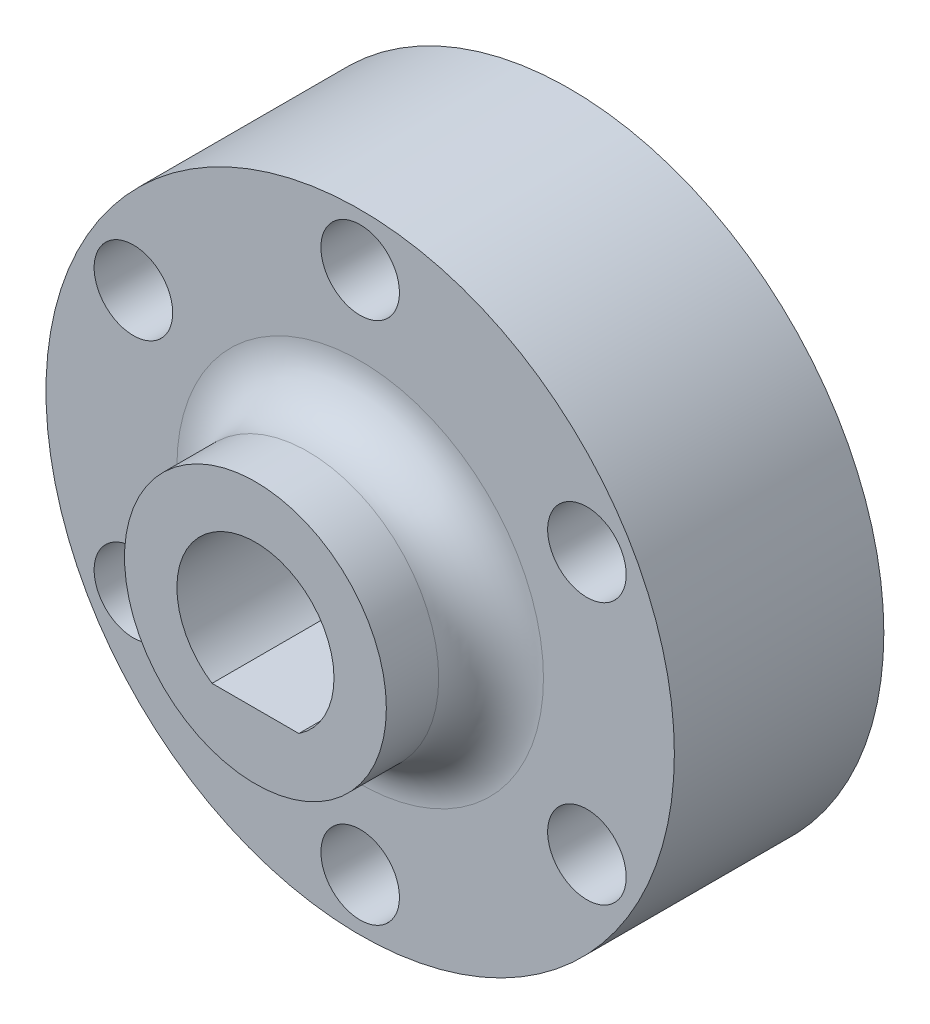
ISO-10303-21;
HEADER;
FILE_DESCRIPTION(('STEP AP214'),'2;1');
FILE_NAME('part.step','',(''),(''),'','','');
FILE_SCHEMA(('AUTOMOTIVE_DESIGN { 1 0 10303 214 1 1 1 1 }'));
ENDSEC;
DATA;
#1=APPLICATION_CONTEXT('core data for automotive mechanical design processes');
#2=APPLICATION_PROTOCOL_DEFINITION('international standard','automotive_design',2000,#1);
#3=PRODUCT_CONTEXT('',#1,'mechanical');
#4=PRODUCT('Part','Part','',(#3));
#5=PRODUCT_RELATED_PRODUCT_CATEGORY('part','',(#4));
#6=PRODUCT_DEFINITION_FORMATION('','',#4);
#7=PRODUCT_DEFINITION_CONTEXT('part definition',#1,'design');
#8=PRODUCT_DEFINITION('design','',#6,#7);
#9=PRODUCT_DEFINITION_SHAPE('','',#8);
#10=(LENGTH_UNIT() NAMED_UNIT(*) SI_UNIT(.MILLI.,.METRE.));
#11=(NAMED_UNIT(*) PLANE_ANGLE_UNIT() SI_UNIT($,.RADIAN.));
#12=(NAMED_UNIT(*) SI_UNIT($,.STERADIAN.) SOLID_ANGLE_UNIT());
#13=UNCERTAINTY_MEASURE_WITH_UNIT(LENGTH_MEASURE(1.E-05),#10,'distance_accuracy_value','');
#14=(GEOMETRIC_REPRESENTATION_CONTEXT(3) GLOBAL_UNCERTAINTY_ASSIGNED_CONTEXT((#13)) GLOBAL_UNIT_ASSIGNED_CONTEXT((#10,
#11,#12)) REPRESENTATION_CONTEXT('',''));
#15=CARTESIAN_POINT('',(0.,0.,0.));
#16=DIRECTION('',(0.,0.,1.));
#17=DIRECTION('',(1.,0.,0.));
#18=AXIS2_PLACEMENT_3D('',#15,#16,#17);
#19=CARTESIAN_POINT('',(0.,0.,8.));
#20=DIRECTION('',(0.,0.,-1.));
#21=DIRECTION('',(-1.,0.,0.));
#22=AXIS2_PLACEMENT_3D('',#19,#20,#21);
#23=CYLINDRICAL_SURFACE('',#22,3.);
#24=DIRECTION('',(0.,0.,1.));
#25=VECTOR('',#24,1.);
#26=CARTESIAN_POINT('',(1.6583123951777,-2.5,-14.1421356237309));
#27=LINE('',#26,#25);
#28=CARTESIAN_POINT('',(1.6583123951777,-2.5,0.));
#29=VERTEX_POINT('',#28);
#30=CARTESIAN_POINT('',(1.6583123951777,-2.5,12.));
#31=VERTEX_POINT('',#30);
#32=EDGE_CURVE('E67',#29,#31,#27,.T.);
#33=ORIENTED_EDGE('',*,*,#32,.T.);
#34=CARTESIAN_POINT('',(0.,0.,12.));
#35=DIRECTION('',(0.,0.,1.));
#36=DIRECTION('',(1.,0.,0.));
#37=AXIS2_PLACEMENT_3D('',#34,#35,#36);
#38=CIRCLE('',#37,3.);
#39=CARTESIAN_POINT('',(-1.6583123951777,-2.5,12.));
#40=VERTEX_POINT('',#39);
#41=EDGE_CURVE('E70',#40,#31,#38,.F.);
#42=ORIENTED_EDGE('',*,*,#41,.F.);
#43=DIRECTION('',(0.,0.,1.));
#44=VECTOR('',#43,1.);
#45=CARTESIAN_POINT('',(-1.6583123951777,-2.5,-14.1421356237309));
#46=LINE('',#45,#44);
#47=CARTESIAN_POINT('',(-1.6583123951777,-2.5,0.));
#48=VERTEX_POINT('',#47);
#49=EDGE_CURVE('E85',#48,#40,#46,.T.);
#50=ORIENTED_EDGE('',*,*,#49,.F.);
#51=CARTESIAN_POINT('',(0.,0.,0.));
#52=DIRECTION('',(0.,0.,1.));
#53=DIRECTION('',(1.,0.,0.));
#54=AXIS2_PLACEMENT_3D('',#51,#52,#53);
#55=CIRCLE('',#54,3.);
#56=EDGE_CURVE('E72',#29,#48,#55,.T.);
#57=ORIENTED_EDGE('',*,*,#56,.F.);
#58=EDGE_LOOP('',(#33,#42,#50,#57));
#59=FACE_BOUND('',#58,.T.);
#60=ADVANCED_FACE('F41',(#59),#23,.F.);
#61=CARTESIAN_POINT('',(0.,0.,8.));
#62=DIRECTION('',(0.,0.,-1.));
#63=DIRECTION('',(-1.,0.,0.));
#64=AXIS2_PLACEMENT_3D('',#61,#62,#63);
#65=CYLINDRICAL_SURFACE('',#64,12.);
#66=CARTESIAN_POINT('',(0.,0.,8.));
#67=DIRECTION('',(0.,0.,1.));
#68=DIRECTION('',(1.,0.,0.));
#69=AXIS2_PLACEMENT_3D('',#66,#67,#68);
#70=CIRCLE('',#69,12.);
#71=CARTESIAN_POINT('',(12.,0.,8.));
#72=VERTEX_POINT('',#71);
#73=EDGE_CURVE('E121',#72,#72,#70,.T.);
#74=ORIENTED_EDGE('',*,*,#73,.F.);
#75=EDGE_LOOP('',(#74));
#76=FACE_BOUND('',#75,.T.);
#77=CARTESIAN_POINT('',(0.,0.,0.));
#78=DIRECTION('',(0.,0.,1.));
#79=DIRECTION('',(1.,0.,0.));
#80=AXIS2_PLACEMENT_3D('',#77,#78,#79);
#81=CIRCLE('',#80,12.);
#82=CARTESIAN_POINT('',(12.,0.,0.));
#83=VERTEX_POINT('',#82);
#84=EDGE_CURVE('E148',#83,#83,#81,.T.);
#85=ORIENTED_EDGE('',*,*,#84,.T.);
#86=EDGE_LOOP('',(#85));
#87=FACE_BOUND('',#86,.T.);
#88=ADVANCED_FACE('F168',(#76,#87),#65,.T.);
#89=CARTESIAN_POINT('',(-8.66025403784354,-5.00000000000049,8.));
#90=DIRECTION('',(0.,0.,-1.));
#91=DIRECTION('',(-1.,0.,0.));
#92=AXIS2_PLACEMENT_3D('',#89,#90,#91);
#93=CYLINDRICAL_SURFACE('',#92,1.50000000000104);
#94=CARTESIAN_POINT('',(-8.66025403784354,-5.00000000000049,8.));
#95=DIRECTION('',(0.,0.,1.));
#96=DIRECTION('',(1.,0.,0.));
#97=AXIS2_PLACEMENT_3D('',#94,#95,#96);
#98=CIRCLE('',#97,1.50000000000104);
#99=CARTESIAN_POINT('',(-7.16025403784249,-5.00000000000049,8.));
#100=VERTEX_POINT('',#99);
#101=EDGE_CURVE('E117',#100,#100,#98,.T.);
#102=ORIENTED_EDGE('',*,*,#101,.T.);
#103=EDGE_LOOP('',(#102));
#104=FACE_BOUND('',#103,.T.);
#105=CARTESIAN_POINT('',(-8.66025403784354,-5.00000000000049,0.));
#106=DIRECTION('',(0.,0.,1.));
#107=DIRECTION('',(1.,0.,0.));
#108=AXIS2_PLACEMENT_3D('',#105,#106,#107);
#109=CIRCLE('',#108,1.50000000000104);
#110=CARTESIAN_POINT('',(-7.16025403784249,-5.00000000000049,0.));
#111=VERTEX_POINT('',#110);
#112=EDGE_CURVE('E144',#111,#111,#109,.T.);
#113=ORIENTED_EDGE('',*,*,#112,.F.);
#114=EDGE_LOOP('',(#113));
#115=FACE_BOUND('',#114,.T.);
#116=ADVANCED_FACE('F173',(#104,#115),#93,.F.);
#117=CARTESIAN_POINT('',(1.13319443681872E-12,-10.,8.));
#118=DIRECTION('',(0.,0.,-1.));
#119=DIRECTION('',(-1.,0.,0.));
#120=AXIS2_PLACEMENT_3D('',#117,#118,#119);
#121=CYLINDRICAL_SURFACE('',#120,1.50000000000115);
#122=CARTESIAN_POINT('',(1.13319443681872E-12,-10.,8.));
#123=DIRECTION('',(0.,0.,1.));
#124=DIRECTION('',(1.,0.,0.));
#125=AXIS2_PLACEMENT_3D('',#122,#123,#124);
#126=CIRCLE('',#125,1.50000000000115);
#127=CARTESIAN_POINT('',(1.50000000000228,-10.,8.));
#128=VERTEX_POINT('',#127);
#129=EDGE_CURVE('E113',#128,#128,#126,.T.);
#130=ORIENTED_EDGE('',*,*,#129,.T.);
#131=EDGE_LOOP('',(#130));
#132=FACE_BOUND('',#131,.T.);
#133=CARTESIAN_POINT('',(1.13319443681872E-12,-10.,0.));
#134=DIRECTION('',(0.,0.,1.));
#135=DIRECTION('',(1.,0.,0.));
#136=AXIS2_PLACEMENT_3D('',#133,#134,#135);
#137=CIRCLE('',#136,1.50000000000115);
#138=CARTESIAN_POINT('',(1.50000000000228,-10.,0.));
#139=VERTEX_POINT('',#138);
#140=EDGE_CURVE('E140',#139,#139,#137,.T.);
#141=ORIENTED_EDGE('',*,*,#140,.F.);
#142=EDGE_LOOP('',(#141));
#143=FACE_BOUND('',#142,.T.);
#144=ADVANCED_FACE('F182',(#132,#143),#121,.F.);
#145=CARTESIAN_POINT('',(8.66025403784524,-4.99999999999951,8.));
#146=DIRECTION('',(0.,0.,-1.));
#147=DIRECTION('',(-1.,0.,0.));
#148=AXIS2_PLACEMENT_3D('',#145,#146,#147);
#149=CYLINDRICAL_SURFACE('',#148,1.50000000000071);
#150=CARTESIAN_POINT('',(8.66025403784524,-4.99999999999951,8.));
#151=DIRECTION('',(0.,0.,1.));
#152=DIRECTION('',(1.,0.,0.));
#153=AXIS2_PLACEMENT_3D('',#150,#151,#152);
#154=CIRCLE('',#153,1.50000000000071);
#155=CARTESIAN_POINT('',(10.160254037846,-4.99999999999951,8.));
#156=VERTEX_POINT('',#155);
#157=EDGE_CURVE('E109',#156,#156,#154,.T.);
#158=ORIENTED_EDGE('',*,*,#157,.T.);
#159=EDGE_LOOP('',(#158));
#160=FACE_BOUND('',#159,.T.);
#161=CARTESIAN_POINT('',(8.66025403784524,-4.99999999999951,0.));
#162=DIRECTION('',(0.,0.,1.));
#163=DIRECTION('',(1.,0.,0.));
#164=AXIS2_PLACEMENT_3D('',#161,#162,#163);
#165=CIRCLE('',#164,1.50000000000071);
#166=CARTESIAN_POINT('',(10.160254037846,-4.99999999999951,0.));
#167=VERTEX_POINT('',#166);
#168=EDGE_CURVE('E136',#167,#167,#165,.T.);
#169=ORIENTED_EDGE('',*,*,#168,.F.);
#170=EDGE_LOOP('',(#169));
#171=FACE_BOUND('',#170,.T.);
#172=ADVANCED_FACE('F186',(#160,#171),#149,.F.);
#173=CARTESIAN_POINT('',(8.66025403784467,5.00000000000049,8.));
#174=DIRECTION('',(0.,0.,-1.));
#175=DIRECTION('',(-1.,0.,0.));
#176=AXIS2_PLACEMENT_3D('',#173,#174,#175);
#177=CYLINDRICAL_SURFACE('',#176,1.50000000000015);
#178=CARTESIAN_POINT('',(8.66025403784467,5.00000000000049,8.));
#179=DIRECTION('',(0.,0.,1.));
#180=DIRECTION('',(1.,0.,0.));
#181=AXIS2_PLACEMENT_3D('',#178,#179,#180);
#182=CIRCLE('',#181,1.50000000000015);
#183=CARTESIAN_POINT('',(10.1602540378448,5.00000000000049,8.));
#184=VERTEX_POINT('',#183);
#185=EDGE_CURVE('E105',#184,#184,#182,.T.);
#186=ORIENTED_EDGE('',*,*,#185,.T.);
#187=EDGE_LOOP('',(#186));
#188=FACE_BOUND('',#187,.T.);
#189=CARTESIAN_POINT('',(8.66025403784467,5.00000000000049,0.));
#190=DIRECTION('',(0.,0.,1.));
#191=DIRECTION('',(1.,0.,0.));
#192=AXIS2_PLACEMENT_3D('',#189,#190,#191);
#193=CIRCLE('',#192,1.50000000000015);
#194=CARTESIAN_POINT('',(10.1602540378448,5.00000000000049,0.));
#195=VERTEX_POINT('',#194);
#196=EDGE_CURVE('E132',#195,#195,#193,.T.);
#197=ORIENTED_EDGE('',*,*,#196,.F.);
#198=EDGE_LOOP('',(#197));
#199=FACE_BOUND('',#198,.T.);
#200=ADVANCED_FACE('F190',(#188,#199),#177,.F.);
#201=CARTESIAN_POINT('',(0.,10.,8.));
#202=DIRECTION('',(0.,0.,-1.));
#203=DIRECTION('',(-1.,0.,0.));
#204=AXIS2_PLACEMENT_3D('',#201,#202,#203);
#205=CYLINDRICAL_SURFACE('',#204,1.5);
#206=CARTESIAN_POINT('',(0.,10.,8.));
#207=DIRECTION('',(0.,0.,1.));
#208=DIRECTION('',(1.,0.,0.));
#209=AXIS2_PLACEMENT_3D('',#206,#207,#208);
#210=CIRCLE('',#209,1.5);
#211=CARTESIAN_POINT('',(1.5,10.,8.));
#212=VERTEX_POINT('',#211);
#213=EDGE_CURVE('E101',#212,#212,#210,.T.);
#214=ORIENTED_EDGE('',*,*,#213,.T.);
#215=EDGE_LOOP('',(#214));
#216=FACE_BOUND('',#215,.T.);
#217=CARTESIAN_POINT('',(0.,10.,0.));
#218=DIRECTION('',(0.,0.,1.));
#219=DIRECTION('',(1.,0.,0.));
#220=AXIS2_PLACEMENT_3D('',#217,#218,#219);
#221=CIRCLE('',#220,1.5);
#222=CARTESIAN_POINT('',(1.5,10.,0.));
#223=VERTEX_POINT('',#222);
#224=EDGE_CURVE('E128',#223,#223,#221,.T.);
#225=ORIENTED_EDGE('',*,*,#224,.F.);
#226=EDGE_LOOP('',(#225));
#227=FACE_BOUND('',#226,.T.);
#228=ADVANCED_FACE('F194',(#216,#227),#205,.F.);
#229=CARTESIAN_POINT('',(-8.66025403784411,4.9999999999995,8.));
#230=DIRECTION('',(0.,0.,-1.));
#231=DIRECTION('',(-1.,0.,0.));
#232=AXIS2_PLACEMENT_3D('',#229,#230,#231);
#233=CYLINDRICAL_SURFACE('',#232,1.50000000000053);
#234=CARTESIAN_POINT('',(-8.66025403784411,4.9999999999995,8.));
#235=DIRECTION('',(0.,0.,1.));
#236=DIRECTION('',(1.,0.,0.));
#237=AXIS2_PLACEMENT_3D('',#234,#235,#236);
#238=CIRCLE('',#237,1.50000000000053);
#239=CARTESIAN_POINT('',(-7.16025403784357,4.9999999999995,8.));
#240=VERTEX_POINT('',#239);
#241=EDGE_CURVE('E97',#240,#240,#238,.T.);
#242=ORIENTED_EDGE('',*,*,#241,.T.);
#243=EDGE_LOOP('',(#242));
#244=FACE_BOUND('',#243,.T.);
#245=CARTESIAN_POINT('',(-8.66025403784411,4.9999999999995,0.));
#246=DIRECTION('',(0.,0.,1.));
#247=DIRECTION('',(1.,0.,0.));
#248=AXIS2_PLACEMENT_3D('',#245,#246,#247);
#249=CIRCLE('',#248,1.50000000000053);
#250=CARTESIAN_POINT('',(-7.16025403784357,4.9999999999995,0.));
#251=VERTEX_POINT('',#250);
#252=EDGE_CURVE('E93',#251,#251,#249,.T.);
#253=ORIENTED_EDGE('',*,*,#252,.F.);
#254=EDGE_LOOP('',(#253));
#255=FACE_BOUND('',#254,.T.);
#256=ADVANCED_FACE('F197',(#244,#255),#233,.F.);
#257=CARTESIAN_POINT('',(0.,0.,8.));
#258=DIRECTION('',(0.,0.,1.));
#259=DIRECTION('',(1.,0.,0.));
#260=AXIS2_PLACEMENT_3D('',#257,#258,#259);
#261=PLANE('',#260);
#262=CARTESIAN_POINT('',(0.,0.,8.));
#263=DIRECTION('',(0.,0.,1.));
#264=DIRECTION('',(1.,0.,0.));
#265=AXIS2_PLACEMENT_3D('',#262,#263,#264);
#266=CIRCLE('',#265,7.);
#267=CARTESIAN_POINT('',(7.,0.,8.));
#268=VERTEX_POINT('',#267);
#269=EDGE_CURVE('E11',#268,#268,#266,.F.);
#270=ORIENTED_EDGE('',*,*,#269,.T.);
#271=EDGE_LOOP('',(#270));
#272=FACE_BOUND('',#271,.T.);
#273=ORIENTED_EDGE('',*,*,#241,.F.);
#274=EDGE_LOOP('',(#273));
#275=FACE_BOUND('',#274,.T.);
#276=ORIENTED_EDGE('',*,*,#213,.F.);
#277=EDGE_LOOP('',(#276));
#278=FACE_BOUND('',#277,.T.);
#279=ORIENTED_EDGE('',*,*,#185,.F.);
#280=EDGE_LOOP('',(#279));
#281=FACE_BOUND('',#280,.T.);
#282=ORIENTED_EDGE('',*,*,#157,.F.);
#283=EDGE_LOOP('',(#282));
#284=FACE_BOUND('',#283,.T.);
#285=ORIENTED_EDGE('',*,*,#129,.F.);
#286=EDGE_LOOP('',(#285));
#287=FACE_BOUND('',#286,.T.);
#288=ORIENTED_EDGE('',*,*,#101,.F.);
#289=EDGE_LOOP('',(#288));
#290=FACE_BOUND('',#289,.T.);
#291=ORIENTED_EDGE('',*,*,#73,.T.);
#292=EDGE_LOOP('',(#291));
#293=FACE_BOUND('',#292,.T.);
#294=ADVANCED_FACE('F200',(#272,#275,#278,#281,#284,#287,#290,#293),#261,.T.);
#295=CARTESIAN_POINT('',(0.,0.,0.));
#296=DIRECTION('',(0.,0.,1.));
#297=DIRECTION('',(1.,0.,0.));
#298=AXIS2_PLACEMENT_3D('',#295,#296,#297);
#299=PLANE('',#298);
#300=ORIENTED_EDGE('',*,*,#252,.T.);
#301=EDGE_LOOP('',(#300));
#302=FACE_BOUND('',#301,.T.);
#303=ORIENTED_EDGE('',*,*,#224,.T.);
#304=EDGE_LOOP('',(#303));
#305=FACE_BOUND('',#304,.T.);
#306=ORIENTED_EDGE('',*,*,#196,.T.);
#307=EDGE_LOOP('',(#306));
#308=FACE_BOUND('',#307,.T.);
#309=ORIENTED_EDGE('',*,*,#168,.T.);
#310=EDGE_LOOP('',(#309));
#311=FACE_BOUND('',#310,.T.);
#312=ORIENTED_EDGE('',*,*,#140,.T.);
#313=EDGE_LOOP('',(#312));
#314=FACE_BOUND('',#313,.T.);
#315=ORIENTED_EDGE('',*,*,#112,.T.);
#316=EDGE_LOOP('',(#315));
#317=FACE_BOUND('',#316,.T.);
#318=ORIENTED_EDGE('',*,*,#84,.F.);
#319=EDGE_LOOP('',(#318));
#320=FACE_BOUND('',#319,.T.);
#321=ORIENTED_EDGE('',*,*,#56,.T.);
#322=DIRECTION('',(-1.,0.,0.));
#323=VECTOR('',#322,1.);
#324=CARTESIAN_POINT('',(0.,-2.5,0.));
#325=LINE('',#324,#323);
#326=EDGE_CURVE('E56',#29,#48,#325,.T.);
#327=ORIENTED_EDGE('',*,*,#326,.F.);
#328=EDGE_LOOP('',(#321,#327));
#329=FACE_BOUND('',#328,.T.);
#330=ADVANCED_FACE('F177',(#302,#305,#308,#311,#314,#317,#320,#329),#299,.F.);
#331=CARTESIAN_POINT('',(0.,-2.5,-14.1421356237309));
#332=DIRECTION('',(0.,-1.,0.));
#333=DIRECTION('',(0.,0.,-1.));
#334=AXIS2_PLACEMENT_3D('',#331,#332,#333);
#335=PLANE('',#334);
#336=ORIENTED_EDGE('',*,*,#32,.F.);
#337=ORIENTED_EDGE('',*,*,#326,.T.);
#338=ORIENTED_EDGE('',*,*,#49,.T.);
#339=DIRECTION('',(1.,0.,0.));
#340=VECTOR('',#339,1.);
#341=CARTESIAN_POINT('',(0.,-2.5,12.));
#342=LINE('',#341,#340);
#343=EDGE_CURVE('E81',#40,#31,#342,.T.);
#344=ORIENTED_EDGE('',*,*,#343,.T.);
#345=EDGE_LOOP('',(#336,#337,#338,#344));
#346=FACE_BOUND('',#345,.T.);
#347=ADVANCED_FACE('F84',(#346),#335,.F.);
#348=CARTESIAN_POINT('',(0.,0.,-14.1421356237309));
#349=DIRECTION('',(0.,0.,1.));
#350=DIRECTION('',(1.,0.,0.));
#351=AXIS2_PLACEMENT_3D('',#348,#349,#350);
#352=CYLINDRICAL_SURFACE('',#351,5.);
#353=CARTESIAN_POINT('',(0.,0.,10.));
#354=DIRECTION('',(0.,0.,1.));
#355=DIRECTION('',(1.,0.,0.));
#356=AXIS2_PLACEMENT_3D('',#353,#354,#355);
#357=CIRCLE('',#356,5.);
#358=CARTESIAN_POINT('',(5.,0.,10.));
#359=VERTEX_POINT('',#358);
#360=EDGE_CURVE('E51',#359,#359,#357,.T.);
#361=ORIENTED_EDGE('',*,*,#360,.T.);
#362=EDGE_LOOP('',(#361));
#363=FACE_BOUND('',#362,.T.);
#364=CARTESIAN_POINT('',(0.,0.,12.));
#365=DIRECTION('',(0.,0.,1.));
#366=DIRECTION('',(1.,0.,0.));
#367=AXIS2_PLACEMENT_3D('',#364,#365,#366);
#368=CIRCLE('',#367,5.);
#369=CARTESIAN_POINT('',(5.,0.,12.));
#370=VERTEX_POINT('',#369);
#371=EDGE_CURVE('E76',#370,#370,#368,.T.);
#372=ORIENTED_EDGE('',*,*,#371,.F.);
#373=EDGE_LOOP('',(#372));
#374=FACE_BOUND('',#373,.T.);
#375=ADVANCED_FACE('F157',(#363,#374),#352,.T.);
#376=CARTESIAN_POINT('',(0.,0.,12.));
#377=DIRECTION('',(0.,0.,1.));
#378=DIRECTION('',(1.,0.,0.));
#379=AXIS2_PLACEMENT_3D('',#376,#377,#378);
#380=PLANE('',#379);
#381=ORIENTED_EDGE('',*,*,#41,.T.);
#382=ORIENTED_EDGE('',*,*,#343,.F.);
#383=EDGE_LOOP('',(#381,#382));
#384=FACE_BOUND('',#383,.T.);
#385=ORIENTED_EDGE('',*,*,#371,.T.);
#386=EDGE_LOOP('',(#385));
#387=FACE_BOUND('',#386,.T.);
#388=ADVANCED_FACE('F79',(#384,#387),#380,.T.);
#389=CARTESIAN_POINT('',(0.,0.,10.));
#390=DIRECTION('',(0.,0.,1.));
#391=DIRECTION('',(1.,0.,0.));
#392=AXIS2_PLACEMENT_3D('',#389,#390,#391);
#393=TOROIDAL_SURFACE('',#392,7.,2.);
#394=ORIENTED_EDGE('',*,*,#269,.F.);
#395=EDGE_LOOP('',(#394));
#396=FACE_BOUND('',#395,.T.);
#397=ORIENTED_EDGE('',*,*,#360,.F.);
#398=EDGE_LOOP('',(#397));
#399=FACE_BOUND('',#398,.T.);
#400=ADVANCED_FACE('F43',(#396,#399),#393,.F.);
#401=CLOSED_SHELL('',(#60,#88,#116,#144,#172,#200,#228,#256,#294,#330,#347,#375,#388,#400));
#402=MANIFOLD_SOLID_BREP('B2',#401);
#403=ADVANCED_BREP_SHAPE_REPRESENTATION('',(#18,#402),#14);
#404=SHAPE_DEFINITION_REPRESENTATION(#9,#403);
ENDSEC;
END-ISO-10303-21;
